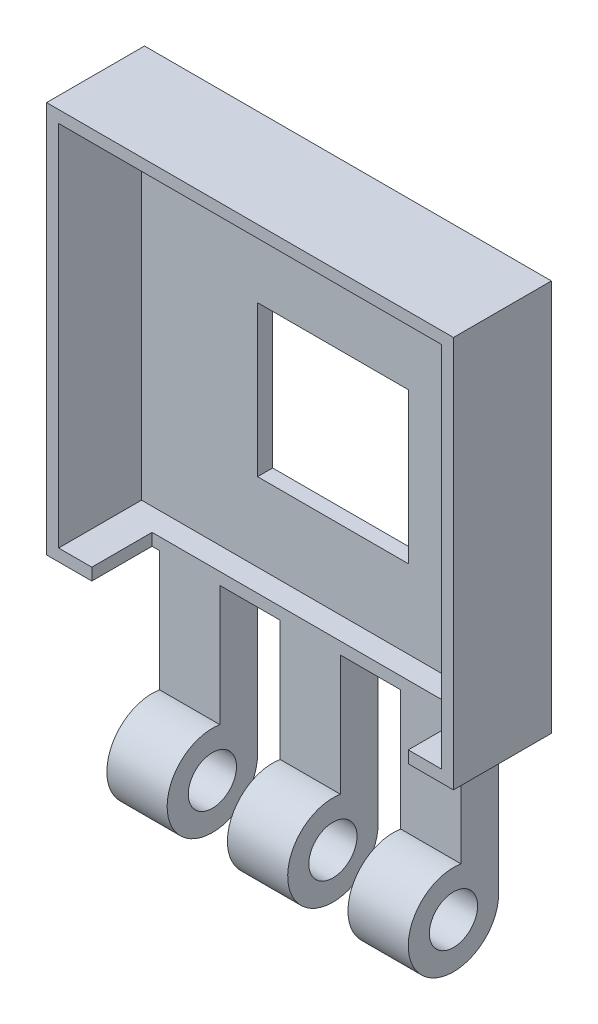
ISO-10303-21;
HEADER;
FILE_DESCRIPTION(('STEP AP214'),'2;1');
FILE_NAME('part.step','',(''),(''),'','','');
FILE_SCHEMA(('AUTOMOTIVE_DESIGN { 1 0 10303 214 1 1 1 1 }'));
ENDSEC;
DATA;
#1=APPLICATION_CONTEXT('core data for automotive mechanical design processes');
#2=APPLICATION_PROTOCOL_DEFINITION('international standard','automotive_design',2000,#1);
#3=PRODUCT_CONTEXT('',#1,'mechanical');
#4=PRODUCT('Part','Part','',(#3));
#5=PRODUCT_RELATED_PRODUCT_CATEGORY('part','',(#4));
#6=PRODUCT_DEFINITION_FORMATION('','',#4);
#7=PRODUCT_DEFINITION_CONTEXT('part definition',#1,'design');
#8=PRODUCT_DEFINITION('design','',#6,#7);
#9=PRODUCT_DEFINITION_SHAPE('','',#8);
#10=(LENGTH_UNIT() NAMED_UNIT(*) SI_UNIT(.MILLI.,.METRE.));
#11=(NAMED_UNIT(*) PLANE_ANGLE_UNIT() SI_UNIT($,.RADIAN.));
#12=(NAMED_UNIT(*) SI_UNIT($,.STERADIAN.) SOLID_ANGLE_UNIT());
#13=UNCERTAINTY_MEASURE_WITH_UNIT(LENGTH_MEASURE(1.E-05),#10,'distance_accuracy_value','');
#14=(GEOMETRIC_REPRESENTATION_CONTEXT(3) GLOBAL_UNCERTAINTY_ASSIGNED_CONTEXT((#13)) GLOBAL_UNIT_ASSIGNED_CONTEXT((#10,
#11,#12)) REPRESENTATION_CONTEXT('',''));
#15=CARTESIAN_POINT('',(0.,0.,0.));
#16=DIRECTION('',(0.,0.,1.));
#17=DIRECTION('',(1.,0.,0.));
#18=AXIS2_PLACEMENT_3D('',#15,#16,#17);
#19=CARTESIAN_POINT('',(-13.5,0.,1.));
#20=DIRECTION('',(0.,1.,0.));
#21=DIRECTION('',(-1.,0.,0.));
#22=AXIS2_PLACEMENT_3D('',#19,#20,#21);
#23=PLANE('',#22);
#24=DIRECTION('',(0.,0.,1.));
#25=VECTOR('',#24,1.);
#26=CARTESIAN_POINT('',(-10.,0.,2.5));
#27=LINE('',#26,#25);
#28=CARTESIAN_POINT('',(-10.,0.,0.));
#29=VERTEX_POINT('',#28);
#30=CARTESIAN_POINT('',(-10.,0.,2.5));
#31=VERTEX_POINT('',#30);
#32=EDGE_CURVE('E224',#29,#31,#27,.T.);
#33=ORIENTED_EDGE('',*,*,#32,.T.);
#34=DIRECTION('',(1.,0.,0.));
#35=VECTOR('',#34,1.);
#36=CARTESIAN_POINT('',(-10.5,0.,2.5));
#37=LINE('',#36,#35);
#38=CARTESIAN_POINT('',(-10.5,0.,2.5));
#39=VERTEX_POINT('',#38);
#40=EDGE_CURVE('E327',#39,#31,#37,.T.);
#41=ORIENTED_EDGE('',*,*,#40,.F.);
#42=DIRECTION('',(0.,0.,-1.));
#43=VECTOR('',#42,1.);
#44=CARTESIAN_POINT('',(-10.5,0.,6.5));
#45=LINE('',#44,#43);
#46=CARTESIAN_POINT('',(-10.5,0.,6.5));
#47=VERTEX_POINT('',#46);
#48=EDGE_CURVE('E323',#47,#39,#45,.T.);
#49=ORIENTED_EDGE('',*,*,#48,.F.);
#50=DIRECTION('',(1.,0.,0.));
#51=VECTOR('',#50,1.);
#52=CARTESIAN_POINT('',(-13.5,0.,6.5));
#53=LINE('',#52,#51);
#54=CARTESIAN_POINT('',(-13.5,0.,6.5));
#55=VERTEX_POINT('',#54);
#56=EDGE_CURVE('E381',#55,#47,#53,.T.);
#57=ORIENTED_EDGE('',*,*,#56,.F.);
#58=DIRECTION('',(0.,0.,-1.));
#59=VECTOR('',#58,1.);
#60=CARTESIAN_POINT('',(-13.5,0.,1.));
#61=LINE('',#60,#59);
#62=CARTESIAN_POINT('',(-13.5,0.,0.));
#63=VERTEX_POINT('',#62);
#64=EDGE_CURVE('E11',#55,#63,#61,.T.);
#65=ORIENTED_EDGE('',*,*,#64,.T.);
#66=DIRECTION('',(1.,0.,0.));
#67=VECTOR('',#66,1.);
#68=CARTESIAN_POINT('',(-13.5,0.,0.));
#69=LINE('',#68,#67);
#70=EDGE_CURVE('E425',#63,#29,#69,.T.);
#71=ORIENTED_EDGE('',*,*,#70,.T.);
#72=EDGE_LOOP('',(#33,#41,#49,#57,#65,#71));
#73=FACE_BOUND('',#72,.T.);
#74=ADVANCED_FACE('F33',(#73),#23,.F.);
#75=DIRECTION('',(0.,0.,1.));
#76=VECTOR('',#75,1.);
#77=CARTESIAN_POINT('',(6.,0.,2.5));
#78=LINE('',#77,#76);
#79=CARTESIAN_POINT('',(6.,0.,0.));
#80=VERTEX_POINT('',#79);
#81=CARTESIAN_POINT('',(6.,0.,2.5));
#82=VERTEX_POINT('',#81);
#83=EDGE_CURVE('E278',#80,#82,#78,.T.);
#84=ORIENTED_EDGE('',*,*,#83,.T.);
#85=CARTESIAN_POINT('',(2.,0.,2.5));
#86=VERTEX_POINT('',#85);
#87=EDGE_CURVE('E331',#86,#82,#37,.T.);
#88=ORIENTED_EDGE('',*,*,#87,.F.);
#89=DIRECTION('',(0.,0.,1.));
#90=VECTOR('',#89,1.);
#91=CARTESIAN_POINT('',(2.,0.,2.5));
#92=LINE('',#91,#90);
#93=CARTESIAN_POINT('',(2.,0.,0.));
#94=VERTEX_POINT('',#93);
#95=EDGE_CURVE('E296',#94,#86,#92,.T.);
#96=ORIENTED_EDGE('',*,*,#95,.F.);
#97=EDGE_CURVE('E430',#94,#80,#69,.T.);
#98=ORIENTED_EDGE('',*,*,#97,.T.);
#99=EDGE_LOOP('',(#84,#88,#96,#98));
#100=FACE_BOUND('',#99,.T.);
#101=ADVANCED_FACE('F508',(#100),#23,.F.);
#102=CARTESIAN_POINT('',(9.99999999999999,0.,2.5));
#103=VERTEX_POINT('',#102);
#104=CARTESIAN_POINT('',(10.5,0.,2.5));
#105=VERTEX_POINT('',#104);
#106=EDGE_CURVE('E326',#103,#105,#37,.T.);
#107=ORIENTED_EDGE('',*,*,#106,.F.);
#108=DIRECTION('',(0.,0.,1.));
#109=VECTOR('',#108,1.);
#110=CARTESIAN_POINT('',(10.,0.,2.5));
#111=LINE('',#110,#109);
#112=CARTESIAN_POINT('',(10.,0.,0.));
#113=VERTEX_POINT('',#112);
#114=EDGE_CURVE('E265',#113,#103,#111,.T.);
#115=ORIENTED_EDGE('',*,*,#114,.F.);
#116=CARTESIAN_POINT('',(13.5,0.,0.));
#117=VERTEX_POINT('',#116);
#118=EDGE_CURVE('E424',#113,#117,#69,.T.);
#119=ORIENTED_EDGE('',*,*,#118,.T.);
#120=DIRECTION('',(0.,0.,-1.));
#121=VECTOR('',#120,1.);
#122=CARTESIAN_POINT('',(13.5,0.,1.));
#123=LINE('',#122,#121);
#124=CARTESIAN_POINT('',(13.5,0.,6.5));
#125=VERTEX_POINT('',#124);
#126=EDGE_CURVE('E41',#125,#117,#123,.T.);
#127=ORIENTED_EDGE('',*,*,#126,.F.);
#128=CARTESIAN_POINT('',(10.5,0.,6.5));
#129=VERTEX_POINT('',#128);
#130=EDGE_CURVE('E380',#129,#125,#53,.T.);
#131=ORIENTED_EDGE('',*,*,#130,.F.);
#132=DIRECTION('',(0.,0.,1.));
#133=VECTOR('',#132,1.);
#134=CARTESIAN_POINT('',(10.5,0.,6.5));
#135=LINE('',#134,#133);
#136=EDGE_CURVE('E329',#105,#129,#135,.T.);
#137=ORIENTED_EDGE('',*,*,#136,.F.);
#138=EDGE_LOOP('',(#107,#115,#119,#127,#131,#137));
#139=FACE_BOUND('',#138,.T.);
#140=ADVANCED_FACE('F467',(#139),#23,.F.);
#141=CARTESIAN_POINT('',(0.,0.,1.));
#142=DIRECTION('',(0.,0.,-1.));
#143=DIRECTION('',(-1.,0.,0.));
#144=AXIS2_PLACEMENT_3D('',#141,#142,#143);
#145=PLANE('',#144);
#146=DIRECTION('',(0.,1.,0.));
#147=VECTOR('',#146,1.);
#148=CARTESIAN_POINT('',(12.7,25.2,1.));
#149=LINE('',#148,#147);
#150=CARTESIAN_POINT('',(12.7,0.799999999999999,1.));
#151=VERTEX_POINT('',#150);
#152=CARTESIAN_POINT('',(12.7,25.2,1.));
#153=VERTEX_POINT('',#152);
#154=EDGE_CURVE('E350',#151,#153,#149,.T.);
#155=ORIENTED_EDGE('',*,*,#154,.T.);
#156=DIRECTION('',(-1.,0.,0.));
#157=VECTOR('',#156,1.);
#158=CARTESIAN_POINT('',(-12.7,25.2,1.));
#159=LINE('',#158,#157);
#160=CARTESIAN_POINT('',(-12.7,25.2,1.));
#161=VERTEX_POINT('',#160);
#162=EDGE_CURVE('E346',#153,#161,#159,.T.);
#163=ORIENTED_EDGE('',*,*,#162,.T.);
#164=DIRECTION('',(0.,-1.,0.));
#165=VECTOR('',#164,1.);
#166=CARTESIAN_POINT('',(-12.7,25.2,1.));
#167=LINE('',#166,#165);
#168=CARTESIAN_POINT('',(-12.7,0.8,1.));
#169=VERTEX_POINT('',#168);
#170=EDGE_CURVE('E361',#161,#169,#167,.T.);
#171=ORIENTED_EDGE('',*,*,#170,.T.);
#172=DIRECTION('',(1.,0.,0.));
#173=VECTOR('',#172,1.);
#174=CARTESIAN_POINT('',(-12.7,0.8,1.));
#175=LINE('',#174,#173);
#176=EDGE_CURVE('E364',#169,#151,#175,.T.);
#177=ORIENTED_EDGE('',*,*,#176,.T.);
#178=EDGE_LOOP('',(#155,#163,#171,#177));
#179=FACE_BOUND('',#178,.T.);
#180=DIRECTION('',(0.,-1.,0.));
#181=VECTOR('',#180,1.);
#182=CARTESIAN_POINT('',(-5.,16.,1.));
#183=LINE('',#182,#181);
#184=CARTESIAN_POINT('',(-5.,16.,1.));
#185=VERTEX_POINT('',#184);
#186=CARTESIAN_POINT('',(-5.,6.,1.));
#187=VERTEX_POINT('',#186);
#188=EDGE_CURVE('E391',#185,#187,#183,.T.);
#189=ORIENTED_EDGE('',*,*,#188,.F.);
#190=DIRECTION('',(-1.,0.,0.));
#191=VECTOR('',#190,1.);
#192=CARTESIAN_POINT('',(-5.,16.,1.));
#193=LINE('',#192,#191);
#194=CARTESIAN_POINT('',(4.99999999999999,16.,1.));
#195=VERTEX_POINT('',#194);
#196=EDGE_CURVE('E399',#195,#185,#193,.T.);
#197=ORIENTED_EDGE('',*,*,#196,.F.);
#198=DIRECTION('',(0.,1.,0.));
#199=VECTOR('',#198,1.);
#200=CARTESIAN_POINT('',(4.99999999999999,16.,1.));
#201=LINE('',#200,#199);
#202=CARTESIAN_POINT('',(5.,6.,1.));
#203=VERTEX_POINT('',#202);
#204=EDGE_CURVE('E396',#203,#195,#201,.T.);
#205=ORIENTED_EDGE('',*,*,#204,.F.);
#206=DIRECTION('',(1.,0.,0.));
#207=VECTOR('',#206,1.);
#208=CARTESIAN_POINT('',(-5.,6.,1.));
#209=LINE('',#208,#207);
#210=EDGE_CURVE('E393',#187,#203,#209,.T.);
#211=ORIENTED_EDGE('',*,*,#210,.F.);
#212=EDGE_LOOP('',(#189,#197,#205,#211));
#213=FACE_BOUND('',#212,.T.);
#214=ADVANCED_FACE('F490',(#179,#213),#145,.F.);
#215=CARTESIAN_POINT('',(0.,0.,0.));
#216=DIRECTION('',(0.,0.,-1.));
#217=DIRECTION('',(-1.,0.,0.));
#218=AXIS2_PLACEMENT_3D('',#215,#216,#217);
#219=PLANE('',#218);
#220=ORIENTED_EDGE('',*,*,#97,.F.);
#221=DIRECTION('',(0.,1.,0.));
#222=VECTOR('',#221,1.);
#223=CARTESIAN_POINT('',(2.,-8.,0.));
#224=LINE('',#223,#222);
#225=CARTESIAN_POINT('',(2.,-10.9580398915498,0.));
#226=VERTEX_POINT('',#225);
#227=EDGE_CURVE('E294',#226,#94,#224,.T.);
#228=ORIENTED_EDGE('',*,*,#227,.F.);
#229=DIRECTION('',(1.,0.,0.));
#230=VECTOR('',#229,1.);
#231=CARTESIAN_POINT('',(-2.,-10.9580398915498,0.));
#232=LINE('',#231,#230);
#233=CARTESIAN_POINT('',(-2.,-10.9580398915498,0.));
#234=VERTEX_POINT('',#233);
#235=EDGE_CURVE('E314',#234,#226,#232,.T.);
#236=ORIENTED_EDGE('',*,*,#235,.F.);
#237=DIRECTION('',(0.,1.,0.));
#238=VECTOR('',#237,1.);
#239=CARTESIAN_POINT('',(-2.,-8.,0.));
#240=LINE('',#239,#238);
#241=CARTESIAN_POINT('',(-2.,0.,0.));
#242=VERTEX_POINT('',#241);
#243=EDGE_CURVE('E307',#234,#242,#240,.T.);
#244=ORIENTED_EDGE('',*,*,#243,.T.);
#245=CARTESIAN_POINT('',(-6.,0.,0.));
#246=VERTEX_POINT('',#245);
#247=EDGE_CURVE('E429',#246,#242,#69,.T.);
#248=ORIENTED_EDGE('',*,*,#247,.F.);
#249=DIRECTION('',(0.,1.,0.));
#250=VECTOR('',#249,1.);
#251=CARTESIAN_POINT('',(-6.,-8.,0.));
#252=LINE('',#251,#250);
#253=CARTESIAN_POINT('',(-6.,-10.9580398915498,0.));
#254=VERTEX_POINT('',#253);
#255=EDGE_CURVE('E231',#254,#246,#252,.T.);
#256=ORIENTED_EDGE('',*,*,#255,.F.);
#257=DIRECTION('',(1.,0.,0.));
#258=VECTOR('',#257,1.);
#259=CARTESIAN_POINT('',(-10.,-10.9580398915498,0.));
#260=LINE('',#259,#258);
#261=CARTESIAN_POINT('',(-10.,-10.9580398915498,0.));
#262=VERTEX_POINT('',#261);
#263=EDGE_CURVE('E223',#262,#254,#260,.T.);
#264=ORIENTED_EDGE('',*,*,#263,.F.);
#265=DIRECTION('',(0.,1.,0.));
#266=VECTOR('',#265,1.);
#267=CARTESIAN_POINT('',(-10.,-8.,0.));
#268=LINE('',#267,#266);
#269=EDGE_CURVE('E251',#262,#29,#268,.T.);
#270=ORIENTED_EDGE('',*,*,#269,.T.);
#271=ORIENTED_EDGE('',*,*,#70,.F.);
#272=DIRECTION('',(0.,-1.,0.));
#273=VECTOR('',#272,1.);
#274=CARTESIAN_POINT('',(-13.5,0.,0.));
#275=LINE('',#274,#273);
#276=CARTESIAN_POINT('',(-13.5,26.,0.));
#277=VERTEX_POINT('',#276);
#278=EDGE_CURVE('E421',#277,#63,#275,.T.);
#279=ORIENTED_EDGE('',*,*,#278,.F.);
#280=DIRECTION('',(-1.,0.,0.));
#281=VECTOR('',#280,1.);
#282=CARTESIAN_POINT('',(-13.5,26.,0.));
#283=LINE('',#282,#281);
#284=CARTESIAN_POINT('',(13.5,26.,0.));
#285=VERTEX_POINT('',#284);
#286=EDGE_CURVE('E432',#285,#277,#283,.T.);
#287=ORIENTED_EDGE('',*,*,#286,.F.);
#288=DIRECTION('',(0.,1.,0.));
#289=VECTOR('',#288,1.);
#290=CARTESIAN_POINT('',(13.5,0.,0.));
#291=LINE('',#290,#289);
#292=EDGE_CURVE('E428',#117,#285,#291,.T.);
#293=ORIENTED_EDGE('',*,*,#292,.F.);
#294=ORIENTED_EDGE('',*,*,#118,.F.);
#295=DIRECTION('',(0.,1.,0.));
#296=VECTOR('',#295,1.);
#297=CARTESIAN_POINT('',(10.,-8.,0.));
#298=LINE('',#297,#296);
#299=CARTESIAN_POINT('',(10.,-10.9580398915498,0.));
#300=VERTEX_POINT('',#299);
#301=EDGE_CURVE('E263',#300,#113,#298,.T.);
#302=ORIENTED_EDGE('',*,*,#301,.F.);
#303=DIRECTION('',(1.,0.,0.));
#304=VECTOR('',#303,1.);
#305=CARTESIAN_POINT('',(6.,-10.9580398915498,0.));
#306=LINE('',#305,#304);
#307=CARTESIAN_POINT('',(6.,-10.9580398915498,0.));
#308=VERTEX_POINT('',#307);
#309=EDGE_CURVE('E282',#308,#300,#306,.T.);
#310=ORIENTED_EDGE('',*,*,#309,.F.);
#311=DIRECTION('',(0.,1.,0.));
#312=VECTOR('',#311,1.);
#313=CARTESIAN_POINT('',(6.,-8.,0.));
#314=LINE('',#313,#312);
#315=EDGE_CURVE('E276',#308,#80,#314,.T.);
#316=ORIENTED_EDGE('',*,*,#315,.T.);
#317=EDGE_LOOP('',(#220,#228,#236,#244,#248,#256,#264,#270,#271,#279,#287,#293,#294,#302,#310,#316));
#318=FACE_BOUND('',#317,.T.);
#319=DIRECTION('',(-1.,0.,0.));
#320=VECTOR('',#319,1.);
#321=CARTESIAN_POINT('',(-5.,16.,0.));
#322=LINE('',#321,#320);
#323=CARTESIAN_POINT('',(4.99999999999999,16.,0.));
#324=VERTEX_POINT('',#323);
#325=CARTESIAN_POINT('',(-5.,16.,0.));
#326=VERTEX_POINT('',#325);
#327=EDGE_CURVE('E394',#324,#326,#322,.T.);
#328=ORIENTED_EDGE('',*,*,#327,.T.);
#329=DIRECTION('',(0.,-1.,0.));
#330=VECTOR('',#329,1.);
#331=CARTESIAN_POINT('',(-5.,16.,0.));
#332=LINE('',#331,#330);
#333=CARTESIAN_POINT('',(-5.,6.,0.));
#334=VERTEX_POINT('',#333);
#335=EDGE_CURVE('E390',#326,#334,#332,.T.);
#336=ORIENTED_EDGE('',*,*,#335,.T.);
#337=DIRECTION('',(1.,0.,0.));
#338=VECTOR('',#337,1.);
#339=CARTESIAN_POINT('',(-5.,6.,0.));
#340=LINE('',#339,#338);
#341=CARTESIAN_POINT('',(5.,6.,0.));
#342=VERTEX_POINT('',#341);
#343=EDGE_CURVE('E404',#334,#342,#340,.T.);
#344=ORIENTED_EDGE('',*,*,#343,.T.);
#345=DIRECTION('',(0.,1.,0.));
#346=VECTOR('',#345,1.);
#347=CARTESIAN_POINT('',(4.99999999999999,16.,0.));
#348=LINE('',#347,#346);
#349=EDGE_CURVE('E407',#342,#324,#348,.T.);
#350=ORIENTED_EDGE('',*,*,#349,.T.);
#351=EDGE_LOOP('',(#328,#336,#344,#350));
#352=FACE_BOUND('',#351,.T.);
#353=ADVANCED_FACE('F451',(#318,#352),#219,.T.);
#354=CARTESIAN_POINT('',(-13.5,0.,1.));
#355=DIRECTION('',(1.,0.,0.));
#356=DIRECTION('',(0.,1.,0.));
#357=AXIS2_PLACEMENT_3D('',#354,#355,#356);
#358=PLANE('',#357);
#359=ORIENTED_EDGE('',*,*,#278,.T.);
#360=ORIENTED_EDGE('',*,*,#64,.F.);
#361=DIRECTION('',(0.,-1.,0.));
#362=VECTOR('',#361,1.);
#363=CARTESIAN_POINT('',(-13.5,26.,6.5));
#364=LINE('',#363,#362);
#365=CARTESIAN_POINT('',(-13.5,26.,6.5));
#366=VERTEX_POINT('',#365);
#367=EDGE_CURVE('E377',#366,#55,#364,.T.);
#368=ORIENTED_EDGE('',*,*,#367,.F.);
#369=DIRECTION('',(0.,0.,-1.));
#370=VECTOR('',#369,1.);
#371=CARTESIAN_POINT('',(-13.5,26.,1.));
#372=LINE('',#371,#370);
#373=EDGE_CURVE('E434',#366,#277,#372,.T.);
#374=ORIENTED_EDGE('',*,*,#373,.T.);
#375=EDGE_LOOP('',(#359,#360,#368,#374));
#376=FACE_BOUND('',#375,.T.);
#377=ADVANCED_FACE('F35',(#376),#358,.F.);
#378=CARTESIAN_POINT('',(-6.,0.,2.5));
#379=VERTEX_POINT('',#378);
#380=CARTESIAN_POINT('',(-2.,0.,2.5));
#381=VERTEX_POINT('',#380);
#382=EDGE_CURVE('E330',#379,#381,#37,.T.);
#383=ORIENTED_EDGE('',*,*,#382,.F.);
#384=DIRECTION('',(0.,0.,1.));
#385=VECTOR('',#384,1.);
#386=CARTESIAN_POINT('',(-6.,0.,2.5));
#387=LINE('',#386,#385);
#388=EDGE_CURVE('E236',#246,#379,#387,.T.);
#389=ORIENTED_EDGE('',*,*,#388,.F.);
#390=ORIENTED_EDGE('',*,*,#247,.T.);
#391=DIRECTION('',(0.,0.,1.));
#392=VECTOR('',#391,1.);
#393=CARTESIAN_POINT('',(-2.,0.,2.5));
#394=LINE('',#393,#392);
#395=EDGE_CURVE('E310',#242,#381,#394,.T.);
#396=ORIENTED_EDGE('',*,*,#395,.T.);
#397=EDGE_LOOP('',(#383,#389,#390,#396));
#398=FACE_BOUND('',#397,.T.);
#399=ADVANCED_FACE('F510',(#398),#23,.F.);
#400=CARTESIAN_POINT('',(13.5,0.,1.));
#401=DIRECTION('',(-1.,0.,0.));
#402=DIRECTION('',(0.,-1.,0.));
#403=AXIS2_PLACEMENT_3D('',#400,#401,#402);
#404=PLANE('',#403);
#405=ORIENTED_EDGE('',*,*,#292,.T.);
#406=DIRECTION('',(0.,0.,-1.));
#407=VECTOR('',#406,1.);
#408=CARTESIAN_POINT('',(13.5,26.,1.));
#409=LINE('',#408,#407);
#410=CARTESIAN_POINT('',(13.5,26.,6.5));
#411=VERTEX_POINT('',#410);
#412=EDGE_CURVE('E437',#411,#285,#409,.T.);
#413=ORIENTED_EDGE('',*,*,#412,.F.);
#414=DIRECTION('',(0.,1.,0.));
#415=VECTOR('',#414,1.);
#416=CARTESIAN_POINT('',(13.5,26.,6.5));
#417=LINE('',#416,#415);
#418=EDGE_CURVE('E384',#125,#411,#417,.T.);
#419=ORIENTED_EDGE('',*,*,#418,.F.);
#420=ORIENTED_EDGE('',*,*,#126,.T.);
#421=EDGE_LOOP('',(#405,#413,#419,#420));
#422=FACE_BOUND('',#421,.T.);
#423=ADVANCED_FACE('F444',(#422),#404,.F.);
#424=CARTESIAN_POINT('',(-13.5,26.,1.));
#425=DIRECTION('',(0.,-1.,0.));
#426=DIRECTION('',(1.,0.,0.));
#427=AXIS2_PLACEMENT_3D('',#424,#425,#426);
#428=PLANE('',#427);
#429=ORIENTED_EDGE('',*,*,#286,.T.);
#430=ORIENTED_EDGE('',*,*,#373,.F.);
#431=DIRECTION('',(-1.,0.,0.));
#432=VECTOR('',#431,1.);
#433=CARTESIAN_POINT('',(-13.5,26.,6.5));
#434=LINE('',#433,#432);
#435=EDGE_CURVE('E387',#411,#366,#434,.T.);
#436=ORIENTED_EDGE('',*,*,#435,.F.);
#437=ORIENTED_EDGE('',*,*,#412,.T.);
#438=EDGE_LOOP('',(#429,#430,#436,#437));
#439=FACE_BOUND('',#438,.T.);
#440=ADVANCED_FACE('F456',(#439),#428,.F.);
#441=CARTESIAN_POINT('',(-5.,16.,1.));
#442=DIRECTION('',(1.,0.,0.));
#443=DIRECTION('',(0.,0.,-1.));
#444=AXIS2_PLACEMENT_3D('',#441,#442,#443);
#445=PLANE('',#444);
#446=ORIENTED_EDGE('',*,*,#335,.F.);
#447=DIRECTION('',(0.,0.,-1.));
#448=VECTOR('',#447,1.);
#449=CARTESIAN_POINT('',(-5.,16.,1.));
#450=LINE('',#449,#448);
#451=EDGE_CURVE('E401',#185,#326,#450,.T.);
#452=ORIENTED_EDGE('',*,*,#451,.F.);
#453=ORIENTED_EDGE('',*,*,#188,.T.);
#454=DIRECTION('',(0.,0.,-1.));
#455=VECTOR('',#454,1.);
#456=CARTESIAN_POINT('',(-5.,6.,1.));
#457=LINE('',#456,#455);
#458=EDGE_CURVE('E418',#187,#334,#457,.T.);
#459=ORIENTED_EDGE('',*,*,#458,.T.);
#460=EDGE_LOOP('',(#446,#452,#453,#459));
#461=FACE_BOUND('',#460,.T.);
#462=ADVANCED_FACE('F532',(#461),#445,.T.);
#463=CARTESIAN_POINT('',(-5.,6.,1.));
#464=DIRECTION('',(0.,1.,0.));
#465=DIRECTION('',(0.,0.,1.));
#466=AXIS2_PLACEMENT_3D('',#463,#464,#465);
#467=PLANE('',#466);
#468=ORIENTED_EDGE('',*,*,#343,.F.);
#469=ORIENTED_EDGE('',*,*,#458,.F.);
#470=ORIENTED_EDGE('',*,*,#210,.T.);
#471=DIRECTION('',(0.,0.,-1.));
#472=VECTOR('',#471,1.);
#473=CARTESIAN_POINT('',(5.,6.,1.));
#474=LINE('',#473,#472);
#475=EDGE_CURVE('E416',#203,#342,#474,.T.);
#476=ORIENTED_EDGE('',*,*,#475,.T.);
#477=EDGE_LOOP('',(#468,#469,#470,#476));
#478=FACE_BOUND('',#477,.T.);
#479=ADVANCED_FACE('F539',(#478),#467,.T.);
#480=CARTESIAN_POINT('',(4.99999999999999,16.,1.));
#481=DIRECTION('',(-1.,0.,0.));
#482=DIRECTION('',(0.,-1.,0.));
#483=AXIS2_PLACEMENT_3D('',#480,#481,#482);
#484=PLANE('',#483);
#485=ORIENTED_EDGE('',*,*,#349,.F.);
#486=ORIENTED_EDGE('',*,*,#475,.F.);
#487=ORIENTED_EDGE('',*,*,#204,.T.);
#488=DIRECTION('',(0.,0.,-1.));
#489=VECTOR('',#488,1.);
#490=CARTESIAN_POINT('',(4.99999999999999,16.,1.));
#491=LINE('',#490,#489);
#492=EDGE_CURVE('E414',#195,#324,#491,.T.);
#493=ORIENTED_EDGE('',*,*,#492,.T.);
#494=EDGE_LOOP('',(#485,#486,#487,#493));
#495=FACE_BOUND('',#494,.T.);
#496=ADVANCED_FACE('F544',(#495),#484,.T.);
#497=CARTESIAN_POINT('',(-5.,16.,1.));
#498=DIRECTION('',(0.,-1.,0.));
#499=DIRECTION('',(1.,0.,0.));
#500=AXIS2_PLACEMENT_3D('',#497,#498,#499);
#501=PLANE('',#500);
#502=ORIENTED_EDGE('',*,*,#327,.F.);
#503=ORIENTED_EDGE('',*,*,#492,.F.);
#504=ORIENTED_EDGE('',*,*,#196,.T.);
#505=ORIENTED_EDGE('',*,*,#451,.T.);
#506=EDGE_LOOP('',(#502,#503,#504,#505));
#507=FACE_BOUND('',#506,.T.);
#508=ADVANCED_FACE('F551',(#507),#501,.T.);
#509=CARTESIAN_POINT('',(0.,0.,6.5));
#510=DIRECTION('',(0.,0.,1.));
#511=DIRECTION('',(1.,0.,0.));
#512=AXIS2_PLACEMENT_3D('',#509,#510,#511);
#513=PLANE('',#512);
#514=DIRECTION('',(0.,-1.,0.));
#515=VECTOR('',#514,1.);
#516=CARTESIAN_POINT('',(10.5,26.001,6.5));
#517=LINE('',#516,#515);
#518=CARTESIAN_POINT('',(10.5,0.799999999999999,6.5));
#519=VERTEX_POINT('',#518);
#520=EDGE_CURVE('E337',#519,#129,#517,.T.);
#521=ORIENTED_EDGE('',*,*,#520,.T.);
#522=ORIENTED_EDGE('',*,*,#130,.T.);
#523=ORIENTED_EDGE('',*,*,#418,.T.);
#524=ORIENTED_EDGE('',*,*,#435,.T.);
#525=ORIENTED_EDGE('',*,*,#367,.T.);
#526=ORIENTED_EDGE('',*,*,#56,.T.);
#527=DIRECTION('',(0.,-1.,0.));
#528=VECTOR('',#527,1.);
#529=CARTESIAN_POINT('',(-10.5,26.001,6.5));
#530=LINE('',#529,#528);
#531=CARTESIAN_POINT('',(-10.5,0.8,6.5));
#532=VERTEX_POINT('',#531);
#533=EDGE_CURVE('E334',#532,#47,#530,.T.);
#534=ORIENTED_EDGE('',*,*,#533,.F.);
#535=DIRECTION('',(1.,0.,0.));
#536=VECTOR('',#535,1.);
#537=CARTESIAN_POINT('',(-12.7,0.8,6.5));
#538=LINE('',#537,#536);
#539=CARTESIAN_POINT('',(-12.7,0.8,6.5));
#540=VERTEX_POINT('',#539);
#541=EDGE_CURVE('E353',#540,#532,#538,.T.);
#542=ORIENTED_EDGE('',*,*,#541,.F.);
#543=DIRECTION('',(0.,-1.,0.));
#544=VECTOR('',#543,1.);
#545=CARTESIAN_POINT('',(-12.7,25.2,6.5));
#546=LINE('',#545,#544);
#547=CARTESIAN_POINT('',(-12.7,25.2,6.5));
#548=VERTEX_POINT('',#547);
#549=EDGE_CURVE('E349',#548,#540,#546,.T.);
#550=ORIENTED_EDGE('',*,*,#549,.F.);
#551=DIRECTION('',(-1.,0.,0.));
#552=VECTOR('',#551,1.);
#553=CARTESIAN_POINT('',(-12.7,25.2,6.5));
#554=LINE('',#553,#552);
#555=CARTESIAN_POINT('',(12.7,25.2,6.5));
#556=VERTEX_POINT('',#555);
#557=EDGE_CURVE('E347',#556,#548,#554,.T.);
#558=ORIENTED_EDGE('',*,*,#557,.F.);
#559=DIRECTION('',(0.,1.,0.));
#560=VECTOR('',#559,1.);
#561=CARTESIAN_POINT('',(12.7,25.2,6.5));
#562=LINE('',#561,#560);
#563=CARTESIAN_POINT('',(12.7,0.799999999999999,6.5));
#564=VERTEX_POINT('',#563);
#565=EDGE_CURVE('E356',#564,#556,#562,.T.);
#566=ORIENTED_EDGE('',*,*,#565,.F.);
#567=EDGE_CURVE('E352',#519,#564,#538,.T.);
#568=ORIENTED_EDGE('',*,*,#567,.F.);
#569=EDGE_LOOP('',(#521,#522,#523,#524,#525,#526,#534,#542,#550,#558,#566,#568));
#570=FACE_BOUND('',#569,.T.);
#571=ADVANCED_FACE('F462',(#570),#513,.T.);
#572=CARTESIAN_POINT('',(-12.7,25.2,6.5));
#573=DIRECTION('',(0.,-1.,0.));
#574=DIRECTION('',(0.,0.,-1.));
#575=AXIS2_PLACEMENT_3D('',#572,#573,#574);
#576=PLANE('',#575);
#577=ORIENTED_EDGE('',*,*,#162,.F.);
#578=DIRECTION('',(0.,0.,-1.));
#579=VECTOR('',#578,1.);
#580=CARTESIAN_POINT('',(12.7,25.2,6.5));
#581=LINE('',#580,#579);
#582=EDGE_CURVE('E358',#556,#153,#581,.T.);
#583=ORIENTED_EDGE('',*,*,#582,.F.);
#584=ORIENTED_EDGE('',*,*,#557,.T.);
#585=DIRECTION('',(0.,0.,-1.));
#586=VECTOR('',#585,1.);
#587=CARTESIAN_POINT('',(-12.7,25.2,6.5));
#588=LINE('',#587,#586);
#589=EDGE_CURVE('E374',#548,#161,#588,.T.);
#590=ORIENTED_EDGE('',*,*,#589,.T.);
#591=EDGE_LOOP('',(#577,#583,#584,#590));
#592=FACE_BOUND('',#591,.T.);
#593=ADVANCED_FACE('F494',(#592),#576,.T.);
#594=CARTESIAN_POINT('',(-12.7,25.2,6.5));
#595=DIRECTION('',(1.,0.,0.));
#596=DIRECTION('',(0.,1.,0.));
#597=AXIS2_PLACEMENT_3D('',#594,#595,#596);
#598=PLANE('',#597);
#599=ORIENTED_EDGE('',*,*,#170,.F.);
#600=ORIENTED_EDGE('',*,*,#589,.F.);
#601=ORIENTED_EDGE('',*,*,#549,.T.);
#602=DIRECTION('',(0.,0.,-1.));
#603=VECTOR('',#602,1.);
#604=CARTESIAN_POINT('',(-12.7,0.8,6.5));
#605=LINE('',#604,#603);
#606=EDGE_CURVE('E372',#540,#169,#605,.T.);
#607=ORIENTED_EDGE('',*,*,#606,.T.);
#608=EDGE_LOOP('',(#599,#600,#601,#607));
#609=FACE_BOUND('',#608,.T.);
#610=ADVANCED_FACE('F485',(#609),#598,.T.);
#611=CARTESIAN_POINT('',(-12.7,0.8,6.5));
#612=DIRECTION('',(0.,1.,0.));
#613=DIRECTION('',(-1.,0.,0.));
#614=AXIS2_PLACEMENT_3D('',#611,#612,#613);
#615=PLANE('',#614);
#616=DIRECTION('',(0.,0.,1.));
#617=VECTOR('',#616,1.);
#618=CARTESIAN_POINT('',(10.5,0.799999999999999,6.5));
#619=LINE('',#618,#617);
#620=CARTESIAN_POINT('',(10.5,0.800000000000006,2.5));
#621=VERTEX_POINT('',#620);
#622=EDGE_CURVE('E316',#621,#519,#619,.T.);
#623=ORIENTED_EDGE('',*,*,#622,.T.);
#624=ORIENTED_EDGE('',*,*,#567,.T.);
#625=DIRECTION('',(0.,0.,-1.));
#626=VECTOR('',#625,1.);
#627=CARTESIAN_POINT('',(12.7,0.799999999999999,6.5));
#628=LINE('',#627,#626);
#629=EDGE_CURVE('E370',#564,#151,#628,.T.);
#630=ORIENTED_EDGE('',*,*,#629,.T.);
#631=ORIENTED_EDGE('',*,*,#176,.F.);
#632=ORIENTED_EDGE('',*,*,#606,.F.);
#633=ORIENTED_EDGE('',*,*,#541,.T.);
#634=DIRECTION('',(0.,0.,-1.));
#635=VECTOR('',#634,1.);
#636=CARTESIAN_POINT('',(-10.5,0.799999999999999,6.5));
#637=LINE('',#636,#635);
#638=CARTESIAN_POINT('',(-10.5,0.8,2.5));
#639=VERTEX_POINT('',#638);
#640=EDGE_CURVE('E320',#532,#639,#637,.T.);
#641=ORIENTED_EDGE('',*,*,#640,.T.);
#642=DIRECTION('',(1.,0.,0.));
#643=VECTOR('',#642,1.);
#644=CARTESIAN_POINT('',(-10.5,0.799999999999999,2.5));
#645=LINE('',#644,#643);
#646=EDGE_CURVE('E336',#639,#621,#645,.T.);
#647=ORIENTED_EDGE('',*,*,#646,.T.);
#648=EDGE_LOOP('',(#623,#624,#630,#631,#632,#633,#641,#647));
#649=FACE_BOUND('',#648,.T.);
#650=ADVANCED_FACE('F474',(#649),#615,.T.);
#651=CARTESIAN_POINT('',(12.7,25.2,6.5));
#652=DIRECTION('',(-1.,0.,0.));
#653=DIRECTION('',(0.,-1.,0.));
#654=AXIS2_PLACEMENT_3D('',#651,#652,#653);
#655=PLANE('',#654);
#656=ORIENTED_EDGE('',*,*,#154,.F.);
#657=ORIENTED_EDGE('',*,*,#629,.F.);
#658=ORIENTED_EDGE('',*,*,#565,.T.);
#659=ORIENTED_EDGE('',*,*,#582,.T.);
#660=EDGE_LOOP('',(#656,#657,#658,#659));
#661=FACE_BOUND('',#660,.T.);
#662=ADVANCED_FACE('F497',(#661),#655,.T.);
#663=CARTESIAN_POINT('',(-10.5,26.001,2.5));
#664=DIRECTION('',(0.,0.,-1.));
#665=DIRECTION('',(-1.,0.,0.));
#666=AXIS2_PLACEMENT_3D('',#663,#664,#665);
#667=PLANE('',#666);
#668=ORIENTED_EDGE('',*,*,#382,.T.);
#669=DIRECTION('',(0.,-1.,0.));
#670=VECTOR('',#669,1.);
#671=CARTESIAN_POINT('',(-2.,0.,2.5));
#672=LINE('',#671,#670);
#673=CARTESIAN_POINT('',(-2.,-8.,2.5));
#674=VERTEX_POINT('',#673);
#675=EDGE_CURVE('E301',#381,#674,#672,.T.);
#676=ORIENTED_EDGE('',*,*,#675,.T.);
#677=DIRECTION('',(1.,0.,0.));
#678=VECTOR('',#677,1.);
#679=CARTESIAN_POINT('',(-2.,-8.,2.5));
#680=LINE('',#679,#678);
#681=CARTESIAN_POINT('',(2.,-8.,2.5));
#682=VERTEX_POINT('',#681);
#683=EDGE_CURVE('E313',#674,#682,#680,.T.);
#684=ORIENTED_EDGE('',*,*,#683,.T.);
#685=DIRECTION('',(0.,-1.,0.));
#686=VECTOR('',#685,1.);
#687=CARTESIAN_POINT('',(2.,0.,2.5));
#688=LINE('',#687,#686);
#689=EDGE_CURVE('E288',#86,#682,#688,.T.);
#690=ORIENTED_EDGE('',*,*,#689,.F.);
#691=ORIENTED_EDGE('',*,*,#87,.T.);
#692=DIRECTION('',(0.,-1.,0.));
#693=VECTOR('',#692,1.);
#694=CARTESIAN_POINT('',(6.,0.,2.5));
#695=LINE('',#694,#693);
#696=CARTESIAN_POINT('',(6.,-8.,2.5));
#697=VERTEX_POINT('',#696);
#698=EDGE_CURVE('E270',#82,#697,#695,.T.);
#699=ORIENTED_EDGE('',*,*,#698,.T.);
#700=DIRECTION('',(1.,0.,0.));
#701=VECTOR('',#700,1.);
#702=CARTESIAN_POINT('',(6.,-8.,2.5));
#703=LINE('',#702,#701);
#704=CARTESIAN_POINT('',(10.,-8.,2.5));
#705=VERTEX_POINT('',#704);
#706=EDGE_CURVE('E281',#697,#705,#703,.T.);
#707=ORIENTED_EDGE('',*,*,#706,.T.);
#708=DIRECTION('',(0.,-1.,0.));
#709=VECTOR('',#708,1.);
#710=CARTESIAN_POINT('',(10.,0.,2.5));
#711=LINE('',#710,#709);
#712=EDGE_CURVE('E55',#103,#705,#711,.T.);
#713=ORIENTED_EDGE('',*,*,#712,.F.);
#714=ORIENTED_EDGE('',*,*,#106,.T.);
#715=DIRECTION('',(0.,-1.,0.));
#716=VECTOR('',#715,1.);
#717=CARTESIAN_POINT('',(10.5,26.001,2.5));
#718=LINE('',#717,#716);
#719=EDGE_CURVE('E340',#621,#105,#718,.T.);
#720=ORIENTED_EDGE('',*,*,#719,.F.);
#721=ORIENTED_EDGE('',*,*,#646,.F.);
#722=DIRECTION('',(0.,-1.,0.));
#723=VECTOR('',#722,1.);
#724=CARTESIAN_POINT('',(-10.5,26.001,2.5));
#725=LINE('',#724,#723);
#726=EDGE_CURVE('E333',#639,#39,#725,.T.);
#727=ORIENTED_EDGE('',*,*,#726,.T.);
#728=ORIENTED_EDGE('',*,*,#40,.T.);
#729=DIRECTION('',(0.,-1.,0.));
#730=VECTOR('',#729,1.);
#731=CARTESIAN_POINT('',(-10.,0.,2.5));
#732=LINE('',#731,#730);
#733=CARTESIAN_POINT('',(-10.,-8.,2.5));
#734=VERTEX_POINT('',#733);
#735=EDGE_CURVE('E219',#31,#734,#732,.T.);
#736=ORIENTED_EDGE('',*,*,#735,.T.);
#737=DIRECTION('',(1.,0.,0.));
#738=VECTOR('',#737,1.);
#739=CARTESIAN_POINT('',(-10.,-8.,2.5));
#740=LINE('',#739,#738);
#741=CARTESIAN_POINT('',(-6.,-8.,2.5));
#742=VERTEX_POINT('',#741);
#743=EDGE_CURVE('E215',#734,#742,#740,.T.);
#744=ORIENTED_EDGE('',*,*,#743,.T.);
#745=DIRECTION('',(0.,-1.,0.));
#746=VECTOR('',#745,1.);
#747=CARTESIAN_POINT('',(-6.,0.,2.5));
#748=LINE('',#747,#746);
#749=EDGE_CURVE('E48',#379,#742,#748,.T.);
#750=ORIENTED_EDGE('',*,*,#749,.F.);
#751=EDGE_LOOP('',(#668,#676,#684,#690,#691,#699,#707,#713,#714,#720,#721,#727,#728,#736,#744,#750));
#752=FACE_BOUND('',#751,.T.);
#753=ADVANCED_FACE('F217',(#752),#667,.F.);
#754=CARTESIAN_POINT('',(10.5,26.001,6.5));
#755=DIRECTION('',(1.,0.,0.));
#756=DIRECTION('',(0.,0.,-1.));
#757=AXIS2_PLACEMENT_3D('',#754,#755,#756);
#758=PLANE('',#757);
#759=ORIENTED_EDGE('',*,*,#719,.T.);
#760=ORIENTED_EDGE('',*,*,#136,.T.);
#761=ORIENTED_EDGE('',*,*,#520,.F.);
#762=ORIENTED_EDGE('',*,*,#622,.F.);
#763=EDGE_LOOP('',(#759,#760,#761,#762));
#764=FACE_BOUND('',#763,.T.);
#765=ADVANCED_FACE('F470',(#764),#758,.F.);
#766=CARTESIAN_POINT('',(-10.5,26.001,6.5));
#767=DIRECTION('',(-1.,0.,0.));
#768=DIRECTION('',(0.,0.,1.));
#769=AXIS2_PLACEMENT_3D('',#766,#767,#768);
#770=PLANE('',#769);
#771=ORIENTED_EDGE('',*,*,#533,.T.);
#772=ORIENTED_EDGE('',*,*,#48,.T.);
#773=ORIENTED_EDGE('',*,*,#726,.F.);
#774=ORIENTED_EDGE('',*,*,#640,.F.);
#775=EDGE_LOOP('',(#771,#772,#773,#774));
#776=FACE_BOUND('',#775,.T.);
#777=ADVANCED_FACE('F478',(#776),#770,.F.);
#778=CARTESIAN_POINT('',(-2.,-10.9580398915498,3.));
#779=DIRECTION('',(1.,0.,0.));
#780=DIRECTION('',(0.,0.,-1.));
#781=AXIS2_PLACEMENT_3D('',#778,#779,#780);
#782=CYLINDRICAL_SURFACE('',#781,3.);
#783=ORIENTED_EDGE('',*,*,#235,.T.);
#784=CARTESIAN_POINT('',(2.,-10.9580398915498,3.));
#785=DIRECTION('',(1.,0.,0.));
#786=DIRECTION('',(0.,0.,-1.));
#787=AXIS2_PLACEMENT_3D('',#784,#785,#786);
#788=CIRCLE('',#787,3.);
#789=EDGE_CURVE('E291',#682,#226,#788,.T.);
#790=ORIENTED_EDGE('',*,*,#789,.F.);
#791=ORIENTED_EDGE('',*,*,#683,.F.);
#792=CARTESIAN_POINT('',(-2.,-10.9580398915498,3.));
#793=DIRECTION('',(1.,0.,0.));
#794=DIRECTION('',(0.,0.,-1.));
#795=AXIS2_PLACEMENT_3D('',#792,#793,#794);
#796=CIRCLE('',#795,3.);
#797=EDGE_CURVE('E304',#674,#234,#796,.T.);
#798=ORIENTED_EDGE('',*,*,#797,.T.);
#799=EDGE_LOOP('',(#783,#790,#791,#798));
#800=FACE_BOUND('',#799,.T.);
#801=ADVANCED_FACE('F600',(#800),#782,.T.);
#802=CARTESIAN_POINT('',(-2.,-10.9580398915498,3.));
#803=DIRECTION('',(1.,0.,0.));
#804=DIRECTION('',(0.,0.,-1.));
#805=AXIS2_PLACEMENT_3D('',#802,#803,#804);
#806=PLANE('',#805);
#807=CARTESIAN_POINT('',(-2.,-10.9580398915498,3.));
#808=DIRECTION('',(1.,0.,0.));
#809=DIRECTION('',(0.,0.,-1.));
#810=AXIS2_PLACEMENT_3D('',#807,#808,#809);
#811=CIRCLE('',#810,1.6);
#812=CARTESIAN_POINT('',(-2.,-10.9580398915498,1.4));
#813=VERTEX_POINT('',#812);
#814=EDGE_CURVE('E298',#813,#813,#811,.T.);
#815=ORIENTED_EDGE('',*,*,#814,.T.);
#816=EDGE_LOOP('',(#815));
#817=FACE_BOUND('',#816,.T.);
#818=ORIENTED_EDGE('',*,*,#675,.F.);
#819=ORIENTED_EDGE('',*,*,#395,.F.);
#820=ORIENTED_EDGE('',*,*,#243,.F.);
#821=ORIENTED_EDGE('',*,*,#797,.F.);
#822=EDGE_LOOP('',(#818,#819,#820,#821));
#823=FACE_BOUND('',#822,.T.);
#824=ADVANCED_FACE('F609',(#817,#823),#806,.F.);
#825=CARTESIAN_POINT('',(-2.,-10.9580398915498,3.));
#826=DIRECTION('',(1.,0.,0.));
#827=DIRECTION('',(0.,0.,-1.));
#828=AXIS2_PLACEMENT_3D('',#825,#826,#827);
#829=CYLINDRICAL_SURFACE('',#828,1.6);
#830=ORIENTED_EDGE('',*,*,#814,.F.);
#831=EDGE_LOOP('',(#830));
#832=FACE_BOUND('',#831,.T.);
#833=CARTESIAN_POINT('',(2.,-10.9580398915498,3.));
#834=DIRECTION('',(1.,0.,0.));
#835=DIRECTION('',(0.,0.,-1.));
#836=AXIS2_PLACEMENT_3D('',#833,#834,#835);
#837=CIRCLE('',#836,1.6);
#838=CARTESIAN_POINT('',(2.,-10.9580398915498,1.4));
#839=VERTEX_POINT('',#838);
#840=EDGE_CURVE('E284',#839,#839,#837,.T.);
#841=ORIENTED_EDGE('',*,*,#840,.T.);
#842=EDGE_LOOP('',(#841));
#843=FACE_BOUND('',#842,.T.);
#844=ADVANCED_FACE('F620',(#832,#843),#829,.F.);
#845=CARTESIAN_POINT('',(2.,-10.9580398915498,3.));
#846=DIRECTION('',(1.,0.,0.));
#847=DIRECTION('',(0.,0.,-1.));
#848=AXIS2_PLACEMENT_3D('',#845,#846,#847);
#849=PLANE('',#848);
#850=ORIENTED_EDGE('',*,*,#689,.T.);
#851=ORIENTED_EDGE('',*,*,#789,.T.);
#852=ORIENTED_EDGE('',*,*,#227,.T.);
#853=ORIENTED_EDGE('',*,*,#95,.T.);
#854=EDGE_LOOP('',(#850,#851,#852,#853));
#855=FACE_BOUND('',#854,.T.);
#856=ORIENTED_EDGE('',*,*,#840,.F.);
#857=EDGE_LOOP('',(#856));
#858=FACE_BOUND('',#857,.T.);
#859=ADVANCED_FACE('F630',(#855,#858),#849,.T.);
#860=CARTESIAN_POINT('',(6.,-10.9580398915498,3.));
#861=DIRECTION('',(1.,0.,0.));
#862=DIRECTION('',(0.,0.,-1.));
#863=AXIS2_PLACEMENT_3D('',#860,#861,#862);
#864=CYLINDRICAL_SURFACE('',#863,3.);
#865=ORIENTED_EDGE('',*,*,#309,.T.);
#866=CARTESIAN_POINT('',(10.,-10.9580398915498,3.));
#867=DIRECTION('',(1.,0.,0.));
#868=DIRECTION('',(0.,0.,-1.));
#869=AXIS2_PLACEMENT_3D('',#866,#867,#868);
#870=CIRCLE('',#869,3.);
#871=EDGE_CURVE('E260',#705,#300,#870,.T.);
#872=ORIENTED_EDGE('',*,*,#871,.F.);
#873=ORIENTED_EDGE('',*,*,#706,.F.);
#874=CARTESIAN_POINT('',(6.,-10.9580398915498,3.));
#875=DIRECTION('',(1.,0.,0.));
#876=DIRECTION('',(0.,0.,-1.));
#877=AXIS2_PLACEMENT_3D('',#874,#875,#876);
#878=CIRCLE('',#877,3.);
#879=EDGE_CURVE('E273',#697,#308,#878,.T.);
#880=ORIENTED_EDGE('',*,*,#879,.T.);
#881=EDGE_LOOP('',(#865,#872,#873,#880));
#882=FACE_BOUND('',#881,.T.);
#883=ADVANCED_FACE('F639',(#882),#864,.T.);
#884=CARTESIAN_POINT('',(6.,-10.9580398915498,3.));
#885=DIRECTION('',(1.,0.,0.));
#886=DIRECTION('',(0.,0.,-1.));
#887=AXIS2_PLACEMENT_3D('',#884,#885,#886);
#888=PLANE('',#887);
#889=CARTESIAN_POINT('',(6.,-10.9580398915498,3.));
#890=DIRECTION('',(1.,0.,0.));
#891=DIRECTION('',(0.,0.,-1.));
#892=AXIS2_PLACEMENT_3D('',#889,#890,#891);
#893=CIRCLE('',#892,1.6);
#894=CARTESIAN_POINT('',(6.,-10.9580398915498,1.4));
#895=VERTEX_POINT('',#894);
#896=EDGE_CURVE('E267',#895,#895,#893,.T.);
#897=ORIENTED_EDGE('',*,*,#896,.T.);
#898=EDGE_LOOP('',(#897));
#899=FACE_BOUND('',#898,.T.);
#900=ORIENTED_EDGE('',*,*,#698,.F.);
#901=ORIENTED_EDGE('',*,*,#83,.F.);
#902=ORIENTED_EDGE('',*,*,#315,.F.);
#903=ORIENTED_EDGE('',*,*,#879,.F.);
#904=EDGE_LOOP('',(#900,#901,#902,#903));
#905=FACE_BOUND('',#904,.T.);
#906=ADVANCED_FACE('F687',(#899,#905),#888,.F.);
#907=CARTESIAN_POINT('',(6.,-10.9580398915498,3.));
#908=DIRECTION('',(1.,0.,0.));
#909=DIRECTION('',(0.,0.,-1.));
#910=AXIS2_PLACEMENT_3D('',#907,#908,#909);
#911=CYLINDRICAL_SURFACE('',#910,1.6);
#912=ORIENTED_EDGE('',*,*,#896,.F.);
#913=EDGE_LOOP('',(#912));
#914=FACE_BOUND('',#913,.T.);
#915=CARTESIAN_POINT('',(10.,-10.9580398915498,3.));
#916=DIRECTION('',(1.,0.,0.));
#917=DIRECTION('',(0.,0.,-1.));
#918=AXIS2_PLACEMENT_3D('',#915,#916,#917);
#919=CIRCLE('',#918,1.6);
#920=CARTESIAN_POINT('',(10.,-10.9580398915498,1.4));
#921=VERTEX_POINT('',#920);
#922=EDGE_CURVE('E255',#921,#921,#919,.T.);
#923=ORIENTED_EDGE('',*,*,#922,.T.);
#924=EDGE_LOOP('',(#923));
#925=FACE_BOUND('',#924,.T.);
#926=ADVANCED_FACE('F697',(#914,#925),#911,.F.);
#927=CARTESIAN_POINT('',(10.,-10.9580398915498,3.));
#928=DIRECTION('',(1.,0.,0.));
#929=DIRECTION('',(0.,0.,-1.));
#930=AXIS2_PLACEMENT_3D('',#927,#928,#929);
#931=PLANE('',#930);
#932=ORIENTED_EDGE('',*,*,#712,.T.);
#933=ORIENTED_EDGE('',*,*,#871,.T.);
#934=ORIENTED_EDGE('',*,*,#301,.T.);
#935=ORIENTED_EDGE('',*,*,#114,.T.);
#936=EDGE_LOOP('',(#932,#933,#934,#935));
#937=FACE_BOUND('',#936,.T.);
#938=ORIENTED_EDGE('',*,*,#922,.F.);
#939=EDGE_LOOP('',(#938));
#940=FACE_BOUND('',#939,.T.);
#941=ADVANCED_FACE('F707',(#937,#940),#931,.T.);
#942=CARTESIAN_POINT('',(-10.,-10.9580398915498,3.));
#943=DIRECTION('',(1.,0.,0.));
#944=DIRECTION('',(0.,0.,-1.));
#945=AXIS2_PLACEMENT_3D('',#942,#943,#944);
#946=CYLINDRICAL_SURFACE('',#945,3.);
#947=ORIENTED_EDGE('',*,*,#263,.T.);
#948=CARTESIAN_POINT('',(-6.,-10.9580398915498,3.));
#949=DIRECTION('',(1.,0.,0.));
#950=DIRECTION('',(0.,0.,-1.));
#951=AXIS2_PLACEMENT_3D('',#948,#949,#950);
#952=CIRCLE('',#951,3.);
#953=EDGE_CURVE('E227',#742,#254,#952,.T.);
#954=ORIENTED_EDGE('',*,*,#953,.F.);
#955=ORIENTED_EDGE('',*,*,#743,.F.);
#956=CARTESIAN_POINT('',(-10.,-10.9580398915498,3.));
#957=DIRECTION('',(1.,0.,0.));
#958=DIRECTION('',(0.,0.,-1.));
#959=AXIS2_PLACEMENT_3D('',#956,#957,#958);
#960=CIRCLE('',#959,3.);
#961=EDGE_CURVE('E249',#734,#262,#960,.T.);
#962=ORIENTED_EDGE('',*,*,#961,.T.);
#963=EDGE_LOOP('',(#947,#954,#955,#962));
#964=FACE_BOUND('',#963,.T.);
#965=ADVANCED_FACE('F228',(#964),#946,.T.);
#966=CARTESIAN_POINT('',(-10.,-10.9580398915498,3.));
#967=DIRECTION('',(1.,0.,0.));
#968=DIRECTION('',(0.,0.,-1.));
#969=AXIS2_PLACEMENT_3D('',#966,#967,#968);
#970=PLANE('',#969);
#971=CARTESIAN_POINT('',(-10.,-10.9580398915498,3.));
#972=DIRECTION('',(1.,0.,0.));
#973=DIRECTION('',(0.,0.,-1.));
#974=AXIS2_PLACEMENT_3D('',#971,#972,#973);
#975=CIRCLE('',#974,1.6);
#976=CARTESIAN_POINT('',(-10.,-10.9580398915498,1.4));
#977=VERTEX_POINT('',#976);
#978=EDGE_CURVE('E245',#977,#977,#975,.T.);
#979=ORIENTED_EDGE('',*,*,#978,.T.);
#980=EDGE_LOOP('',(#979));
#981=FACE_BOUND('',#980,.T.);
#982=ORIENTED_EDGE('',*,*,#735,.F.);
#983=ORIENTED_EDGE('',*,*,#32,.F.);
#984=ORIENTED_EDGE('',*,*,#269,.F.);
#985=ORIENTED_EDGE('',*,*,#961,.F.);
#986=EDGE_LOOP('',(#982,#983,#984,#985));
#987=FACE_BOUND('',#986,.T.);
#988=ADVANCED_FACE('F726',(#981,#987),#970,.F.);
#989=CARTESIAN_POINT('',(-10.,-10.9580398915498,3.));
#990=DIRECTION('',(1.,0.,0.));
#991=DIRECTION('',(0.,0.,-1.));
#992=AXIS2_PLACEMENT_3D('',#989,#990,#991);
#993=CYLINDRICAL_SURFACE('',#992,1.6);
#994=ORIENTED_EDGE('',*,*,#978,.F.);
#995=EDGE_LOOP('',(#994));
#996=FACE_BOUND('',#995,.T.);
#997=CARTESIAN_POINT('',(-6.,-10.9580398915498,3.));
#998=DIRECTION('',(1.,0.,0.));
#999=DIRECTION('',(0.,0.,-1.));
#1000=AXIS2_PLACEMENT_3D('',#997,#998,#999);
#1001=CIRCLE('',#1000,1.6);
#1002=CARTESIAN_POINT('',(-6.,-10.9580398915498,1.4));
#1003=VERTEX_POINT('',#1002);
#1004=EDGE_CURVE('E238',#1003,#1003,#1001,.T.);
#1005=ORIENTED_EDGE('',*,*,#1004,.T.);
#1006=EDGE_LOOP('',(#1005));
#1007=FACE_BOUND('',#1006,.T.);
#1008=ADVANCED_FACE('F735',(#996,#1007),#993,.F.);
#1009=CARTESIAN_POINT('',(-6.,-10.9580398915498,3.));
#1010=DIRECTION('',(1.,0.,0.));
#1011=DIRECTION('',(0.,0.,-1.));
#1012=AXIS2_PLACEMENT_3D('',#1009,#1010,#1011);
#1013=PLANE('',#1012);
#1014=ORIENTED_EDGE('',*,*,#749,.T.);
#1015=ORIENTED_EDGE('',*,*,#953,.T.);
#1016=ORIENTED_EDGE('',*,*,#255,.T.);
#1017=ORIENTED_EDGE('',*,*,#388,.T.);
#1018=EDGE_LOOP('',(#1014,#1015,#1016,#1017));
#1019=FACE_BOUND('',#1018,.T.);
#1020=ORIENTED_EDGE('',*,*,#1004,.F.);
#1021=EDGE_LOOP('',(#1020));
#1022=FACE_BOUND('',#1021,.T.);
#1023=ADVANCED_FACE('F233',(#1019,#1022),#1013,.T.);
#1024=CLOSED_SHELL('',(#74,#101,#140,#214,#353,#377,#399,#423,#440,#462,#479,#496,#508,#571,
#593,#610,#650,#662,#753,#765,#777,#801,#824,#844,#859,#883,#906,#926,#941,#965,#988,#1008,#1023));
#1025=MANIFOLD_SOLID_BREP('B2',#1024);
#1026=ADVANCED_BREP_SHAPE_REPRESENTATION('',(#18,#1025),#14);
#1027=SHAPE_DEFINITION_REPRESENTATION(#9,#1026);
ENDSEC;
END-ISO-10303-21;
